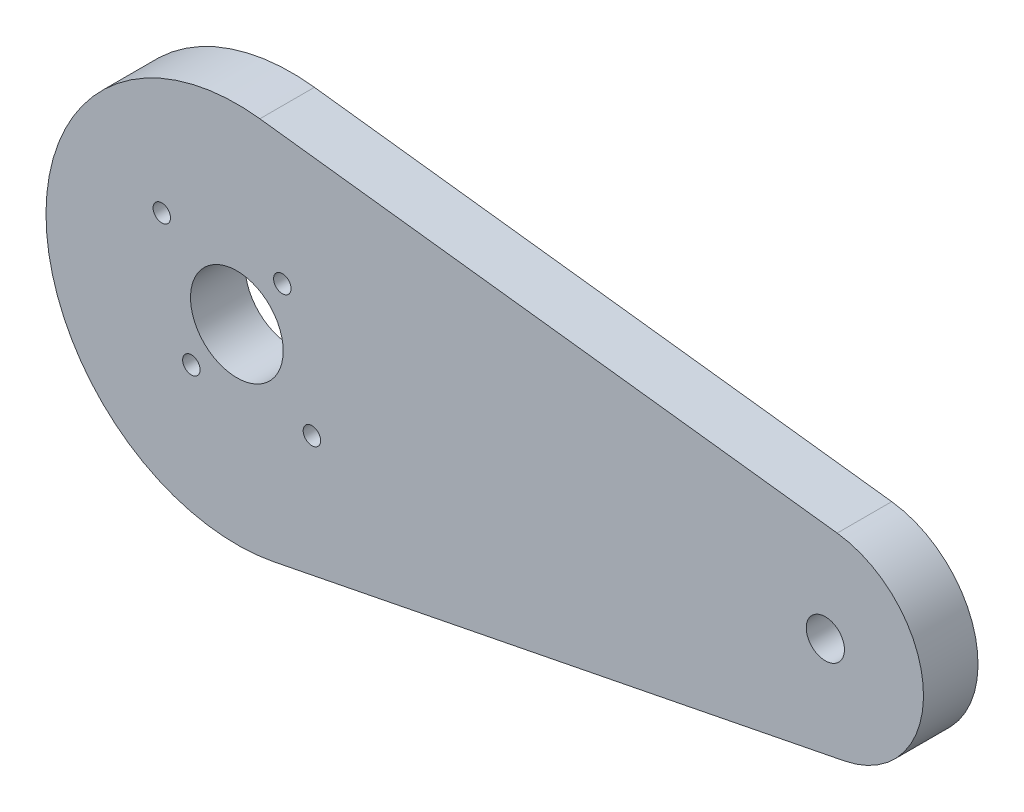
ISO-10303-21;
HEADER;
FILE_DESCRIPTION(('STEP AP214'),'2;1');
FILE_NAME('part.step','',(''),(''),'','','');
FILE_SCHEMA(('AUTOMOTIVE_DESIGN { 1 0 10303 214 1 1 1 1 }'));
ENDSEC;
DATA;
#1=APPLICATION_CONTEXT('core data for automotive mechanical design processes');
#2=APPLICATION_PROTOCOL_DEFINITION('international standard','automotive_design',2000,#1);
#3=PRODUCT_CONTEXT('',#1,'mechanical');
#4=PRODUCT('Part','Part','',(#3));
#5=PRODUCT_RELATED_PRODUCT_CATEGORY('part','',(#4));
#6=PRODUCT_DEFINITION_FORMATION('','',#4);
#7=PRODUCT_DEFINITION_CONTEXT('part definition',#1,'design');
#8=PRODUCT_DEFINITION('design','',#6,#7);
#9=PRODUCT_DEFINITION_SHAPE('','',#8);
#10=(LENGTH_UNIT() NAMED_UNIT(*) SI_UNIT(.MILLI.,.METRE.));
#11=(NAMED_UNIT(*) PLANE_ANGLE_UNIT() SI_UNIT($,.RADIAN.));
#12=(NAMED_UNIT(*) SI_UNIT($,.STERADIAN.) SOLID_ANGLE_UNIT());
#13=UNCERTAINTY_MEASURE_WITH_UNIT(LENGTH_MEASURE(1.E-05),#10,'distance_accuracy_value','');
#14=(GEOMETRIC_REPRESENTATION_CONTEXT(3) GLOBAL_UNCERTAINTY_ASSIGNED_CONTEXT((#13)) GLOBAL_UNIT_ASSIGNED_CONTEXT((#10,
#11,#12)) REPRESENTATION_CONTEXT('',''));
#15=CARTESIAN_POINT('',(0.,0.,0.));
#16=DIRECTION('',(0.,0.,1.));
#17=DIRECTION('',(1.,0.,0.));
#18=AXIS2_PLACEMENT_3D('',#15,#16,#17);
#19=CARTESIAN_POINT('',(33.742734460424,59.5858139379744,-5.));
#20=DIRECTION('',(0.,0.,1.));
#21=DIRECTION('',(1.,0.,0.));
#22=AXIS2_PLACEMENT_3D('',#19,#20,#21);
#23=CYLINDRICAL_SURFACE('',#22,9.);
#24=CARTESIAN_POINT('',(33.742734460424,59.5858139379744,0.));
#25=DIRECTION('',(0.,0.,1.));
#26=DIRECTION('',(-1.,0.,0.));
#27=AXIS2_PLACEMENT_3D('',#24,#25,#26);
#28=CIRCLE('',#27,9.);
#29=CARTESIAN_POINT('',(35.488558308543,50.7567653430612,0.));
#30=VERTEX_POINT('',#29);
#31=CARTESIAN_POINT('',(34.8282886549802,68.5201058567937,0.));
#32=VERTEX_POINT('',#31);
#33=EDGE_CURVE('E98',#30,#32,#28,.T.);
#34=ORIENTED_EDGE('',*,*,#33,.F.);
#35=DIRECTION('',(0.,0.,1.));
#36=VECTOR('',#35,1.);
#37=CARTESIAN_POINT('',(35.488558308543,50.7567653430612,-5.));
#38=LINE('',#37,#36);
#39=CARTESIAN_POINT('',(35.488558308543,50.7567653430612,-5.));
#40=VERTEX_POINT('',#39);
#41=EDGE_CURVE('E11',#40,#30,#38,.T.);
#42=ORIENTED_EDGE('',*,*,#41,.F.);
#43=CARTESIAN_POINT('',(33.742734460424,59.5858139379744,-5.));
#44=DIRECTION('',(0.,0.,1.));
#45=DIRECTION('',(-1.,0.,0.));
#46=AXIS2_PLACEMENT_3D('',#43,#44,#45);
#47=CIRCLE('',#46,9.);
#48=CARTESIAN_POINT('',(34.8282886549802,68.5201058567937,-5.));
#49=VERTEX_POINT('',#48);
#50=EDGE_CURVE('E91',#40,#49,#47,.T.);
#51=ORIENTED_EDGE('',*,*,#50,.T.);
#52=DIRECTION('',(0.,0.,1.));
#53=VECTOR('',#52,1.);
#54=CARTESIAN_POINT('',(34.8282886549802,68.5201058567937,-5.));
#55=LINE('',#54,#53);
#56=EDGE_CURVE('E36',#49,#32,#55,.T.);
#57=ORIENTED_EDGE('',*,*,#56,.T.);
#58=EDGE_LOOP('',(#34,#42,#51,#57));
#59=FACE_BOUND('',#58,.T.);
#60=ADVANCED_FACE('F33',(#59),#23,.T.);
#61=CARTESIAN_POINT('',(-16.825342517547,40.4124055098915,-5.));
#62=DIRECTION('',(0.193980427568784,-0.9810053994348,0.));
#63=DIRECTION('',(0.9810053994348,0.193980427568784,0.));
#64=AXIS2_PLACEMENT_3D('',#61,#62,#63);
#65=PLANE('',#64);
#66=DIRECTION('',(0.9810053994348,0.193980427568784,0.));
#67=VECTOR('',#66,1.);
#68=CARTESIAN_POINT('',(-16.825342517547,40.4124055098915,0.));
#69=LINE('',#68,#67);
#70=CARTESIAN_POINT('',(-16.825342517547,40.4124055098915,0.));
#71=VERTEX_POINT('',#70);
#72=EDGE_CURVE('E93',#71,#30,#69,.T.);
#73=ORIENTED_EDGE('',*,*,#72,.F.);
#74=DIRECTION('',(0.,0.,1.));
#75=VECTOR('',#74,1.);
#76=CARTESIAN_POINT('',(-16.825342517547,40.4124055098915,-5.));
#77=LINE('',#76,#75);
#78=CARTESIAN_POINT('',(-16.825342517547,40.4124055098915,-5.));
#79=VERTEX_POINT('',#78);
#80=EDGE_CURVE('E42',#79,#71,#77,.T.);
#81=ORIENTED_EDGE('',*,*,#80,.F.);
#82=DIRECTION('',(0.9810053994348,0.193980427568784,0.));
#83=VECTOR('',#82,1.);
#84=CARTESIAN_POINT('',(-16.825342517547,40.4124055098915,-5.));
#85=LINE('',#84,#83);
#86=EDGE_CURVE('E88',#79,#40,#85,.T.);
#87=ORIENTED_EDGE('',*,*,#86,.T.);
#88=ORIENTED_EDGE('',*,*,#41,.T.);
#89=EDGE_LOOP('',(#73,#81,#87,#88));
#90=FACE_BOUND('',#89,.T.);
#91=ADVANCED_FACE('F109',(#90),#65,.T.);
#92=CARTESIAN_POINT('',(-20.22,57.5799999999968,-5.));
#93=DIRECTION('',(0.,0.,1.));
#94=DIRECTION('',(1.,0.,0.));
#95=AXIS2_PLACEMENT_3D('',#92,#93,#94);
#96=CYLINDRICAL_SURFACE('',#95,17.4999999999963);
#97=CARTESIAN_POINT('',(-20.22,57.5799999999968,0.));
#98=DIRECTION('',(0.,0.,1.));
#99=DIRECTION('',(1.,0.,0.));
#100=AXIS2_PLACEMENT_3D('',#97,#98,#99);
#101=CIRCLE('',#100,17.4999999999963);
#102=CARTESIAN_POINT('',(-18.1092001772522,74.9522342865864,0.));
#103=VERTEX_POINT('',#102);
#104=EDGE_CURVE('E83',#103,#71,#101,.T.);
#105=ORIENTED_EDGE('',*,*,#104,.F.);
#106=DIRECTION('',(0.,0.,1.));
#107=VECTOR('',#106,1.);
#108=CARTESIAN_POINT('',(-18.1092001772522,74.9522342865864,-5.));
#109=LINE('',#108,#107);
#110=CARTESIAN_POINT('',(-18.1092001772522,74.9522342865864,-5.));
#111=VERTEX_POINT('',#110);
#112=EDGE_CURVE('E78',#111,#103,#109,.T.);
#113=ORIENTED_EDGE('',*,*,#112,.F.);
#114=CARTESIAN_POINT('',(-20.22,57.5799999999968,-5.));
#115=DIRECTION('',(0.,0.,1.));
#116=DIRECTION('',(1.,0.,0.));
#117=AXIS2_PLACEMENT_3D('',#114,#115,#116);
#118=CIRCLE('',#117,17.4999999999963);
#119=EDGE_CURVE('E81',#111,#79,#118,.T.);
#120=ORIENTED_EDGE('',*,*,#119,.T.);
#121=ORIENTED_EDGE('',*,*,#80,.T.);
#122=EDGE_LOOP('',(#105,#113,#120,#121));
#123=FACE_BOUND('',#122,.T.);
#124=ADVANCED_FACE('F80',(#123),#96,.T.);
#125=CARTESIAN_POINT('',(34.8282886549802,68.5201058567937,-5.));
#126=DIRECTION('',(0.120617132728473,0.992699102091042,0.));
#127=DIRECTION('',(-0.992699102091043,0.120617132728473,0.));
#128=AXIS2_PLACEMENT_3D('',#125,#126,#127);
#129=PLANE('',#128);
#130=DIRECTION('',(-0.992699102091043,0.120617132728473,0.));
#131=VECTOR('',#130,1.);
#132=CARTESIAN_POINT('',(34.8282886549802,68.5201058567937,0.));
#133=LINE('',#132,#131);
#134=EDGE_CURVE('E101',#32,#103,#133,.T.);
#135=ORIENTED_EDGE('',*,*,#134,.F.);
#136=ORIENTED_EDGE('',*,*,#56,.F.);
#137=DIRECTION('',(-0.992699102091043,0.120617132728473,0.));
#138=VECTOR('',#137,1.);
#139=CARTESIAN_POINT('',(34.8282886549802,68.5201058567937,-5.));
#140=LINE('',#139,#138);
#141=EDGE_CURVE('E87',#49,#111,#140,.T.);
#142=ORIENTED_EDGE('',*,*,#141,.T.);
#143=ORIENTED_EDGE('',*,*,#112,.T.);
#144=EDGE_LOOP('',(#135,#136,#142,#143));
#145=FACE_BOUND('',#144,.T.);
#146=ADVANCED_FACE('F90',(#145),#129,.T.);
#147=CARTESIAN_POINT('',(33.742734460424,59.5858139379744,-5.));
#148=DIRECTION('',(0.,0.,-1.));
#149=DIRECTION('',(-1.,0.,0.));
#150=AXIS2_PLACEMENT_3D('',#147,#148,#149);
#151=PLANE('',#150);
#152=CARTESIAN_POINT('',(-24.3892947318219,52.2715650668737,-5.));
#153=DIRECTION('',(0.,0.,1.));
#154=DIRECTION('',(1.,0.,0.));
#155=AXIS2_PLACEMENT_3D('',#152,#153,#154);
#156=CIRCLE('',#155,0.800000000000006);
#157=CARTESIAN_POINT('',(-23.5892947318219,52.2715650668737,-5.));
#158=VERTEX_POINT('',#157);
#159=EDGE_CURVE('E158',#158,#158,#156,.T.);
#160=ORIENTED_EDGE('',*,*,#159,.T.);
#161=EDGE_LOOP('',(#160));
#162=FACE_BOUND('',#161,.T.);
#163=CARTESIAN_POINT('',(-13.3386954570625,52.1753586809685,-5.));
#164=DIRECTION('',(0.,0.,1.));
#165=DIRECTION('',(1.,0.,0.));
#166=AXIS2_PLACEMENT_3D('',#163,#164,#165);
#167=CIRCLE('',#166,0.800000000000006);
#168=CARTESIAN_POINT('',(-12.5386954570625,52.1753586809685,-5.));
#169=VERTEX_POINT('',#168);
#170=EDGE_CURVE('E166',#169,#169,#167,.T.);
#171=ORIENTED_EDGE('',*,*,#170,.T.);
#172=EDGE_LOOP('',(#171));
#173=FACE_BOUND('',#172,.T.);
#174=CARTESIAN_POINT('',(-16.0507052681782,62.88843493312,-5.));
#175=DIRECTION('',(0.,0.,1.));
#176=DIRECTION('',(1.,0.,0.));
#177=AXIS2_PLACEMENT_3D('',#174,#175,#176);
#178=CIRCLE('',#177,0.799999999999994);
#179=CARTESIAN_POINT('',(-15.2507052681782,62.88843493312,-5.));
#180=VERTEX_POINT('',#179);
#181=EDGE_CURVE('E172',#180,#180,#178,.T.);
#182=ORIENTED_EDGE('',*,*,#181,.T.);
#183=EDGE_LOOP('',(#182));
#184=FACE_BOUND('',#183,.T.);
#185=CARTESIAN_POINT('',(-27.1013045429374,62.9846413190252,-5.));
#186=DIRECTION('',(0.,0.,1.));
#187=DIRECTION('',(1.,0.,0.));
#188=AXIS2_PLACEMENT_3D('',#185,#186,#187);
#189=CIRCLE('',#188,0.800000000000001);
#190=CARTESIAN_POINT('',(-26.3013045429374,62.9846413190252,-5.));
#191=VERTEX_POINT('',#190);
#192=EDGE_CURVE('E178',#191,#191,#189,.T.);
#193=ORIENTED_EDGE('',*,*,#192,.T.);
#194=EDGE_LOOP('',(#193));
#195=FACE_BOUND('',#194,.T.);
#196=CARTESIAN_POINT('',(-20.22,57.5799999999968,-5.));
#197=DIRECTION('',(0.,0.,1.));
#198=DIRECTION('',(1.,0.,0.));
#199=AXIS2_PLACEMENT_3D('',#196,#197,#198);
#200=CIRCLE('',#199,4.25);
#201=CARTESIAN_POINT('',(-15.97,57.5799999999968,-5.));
#202=VERTEX_POINT('',#201);
#203=EDGE_CURVE('E184',#202,#202,#200,.T.);
#204=ORIENTED_EDGE('',*,*,#203,.T.);
#205=EDGE_LOOP('',(#204));
#206=FACE_BOUND('',#205,.T.);
#207=CARTESIAN_POINT('',(33.742734460424,59.5858139379744,-5.));
#208=DIRECTION('',(0.,0.,1.));
#209=DIRECTION('',(1.,0.,0.));
#210=AXIS2_PLACEMENT_3D('',#207,#208,#209);
#211=CIRCLE('',#210,1.75000000000001);
#212=CARTESIAN_POINT('',(35.492734460424,59.5858139379744,-5.));
#213=VERTEX_POINT('',#212);
#214=EDGE_CURVE('E102',#213,#213,#211,.T.);
#215=ORIENTED_EDGE('',*,*,#214,.T.);
#216=EDGE_LOOP('',(#215));
#217=FACE_BOUND('',#216,.T.);
#218=ORIENTED_EDGE('',*,*,#50,.F.);
#219=ORIENTED_EDGE('',*,*,#86,.F.);
#220=ORIENTED_EDGE('',*,*,#119,.F.);
#221=ORIENTED_EDGE('',*,*,#141,.F.);
#222=EDGE_LOOP('',(#218,#219,#220,#221));
#223=FACE_BOUND('',#222,.T.);
#224=ADVANCED_FACE('F86',(#162,#173,#184,#195,#206,#217,#223),#151,.T.);
#225=CARTESIAN_POINT('',(33.742734460424,59.5858139379744,0.));
#226=DIRECTION('',(0.,0.,-1.));
#227=DIRECTION('',(-1.,0.,0.));
#228=AXIS2_PLACEMENT_3D('',#225,#226,#227);
#229=PLANE('',#228);
#230=CARTESIAN_POINT('',(-24.3892947318219,52.2715650668737,0.));
#231=DIRECTION('',(0.,0.,1.));
#232=DIRECTION('',(1.,0.,0.));
#233=AXIS2_PLACEMENT_3D('',#230,#231,#232);
#234=CIRCLE('',#233,0.800000000000006);
#235=CARTESIAN_POINT('',(-23.5892947318219,52.2715650668737,0.));
#236=VERTEX_POINT('',#235);
#237=EDGE_CURVE('E161',#236,#236,#234,.T.);
#238=ORIENTED_EDGE('',*,*,#237,.F.);
#239=EDGE_LOOP('',(#238));
#240=FACE_BOUND('',#239,.T.);
#241=CARTESIAN_POINT('',(-13.3386954570625,52.1753586809685,0.));
#242=DIRECTION('',(0.,0.,1.));
#243=DIRECTION('',(1.,0.,0.));
#244=AXIS2_PLACEMENT_3D('',#241,#242,#243);
#245=CIRCLE('',#244,0.800000000000006);
#246=CARTESIAN_POINT('',(-12.5386954570625,52.1753586809685,0.));
#247=VERTEX_POINT('',#246);
#248=EDGE_CURVE('E163',#247,#247,#245,.T.);
#249=ORIENTED_EDGE('',*,*,#248,.F.);
#250=EDGE_LOOP('',(#249));
#251=FACE_BOUND('',#250,.T.);
#252=CARTESIAN_POINT('',(-16.0507052681782,62.88843493312,0.));
#253=DIRECTION('',(0.,0.,1.));
#254=DIRECTION('',(1.,0.,0.));
#255=AXIS2_PLACEMENT_3D('',#252,#253,#254);
#256=CIRCLE('',#255,0.799999999999994);
#257=CARTESIAN_POINT('',(-15.2507052681782,62.88843493312,0.));
#258=VERTEX_POINT('',#257);
#259=EDGE_CURVE('E169',#258,#258,#256,.T.);
#260=ORIENTED_EDGE('',*,*,#259,.F.);
#261=EDGE_LOOP('',(#260));
#262=FACE_BOUND('',#261,.T.);
#263=CARTESIAN_POINT('',(-27.1013045429374,62.9846413190252,0.));
#264=DIRECTION('',(0.,0.,1.));
#265=DIRECTION('',(1.,0.,0.));
#266=AXIS2_PLACEMENT_3D('',#263,#264,#265);
#267=CIRCLE('',#266,0.800000000000001);
#268=CARTESIAN_POINT('',(-26.3013045429374,62.9846413190252,0.));
#269=VERTEX_POINT('',#268);
#270=EDGE_CURVE('E175',#269,#269,#267,.T.);
#271=ORIENTED_EDGE('',*,*,#270,.F.);
#272=EDGE_LOOP('',(#271));
#273=FACE_BOUND('',#272,.T.);
#274=CARTESIAN_POINT('',(-20.22,57.5799999999968,0.));
#275=DIRECTION('',(0.,0.,1.));
#276=DIRECTION('',(1.,0.,0.));
#277=AXIS2_PLACEMENT_3D('',#274,#275,#276);
#278=CIRCLE('',#277,4.25);
#279=CARTESIAN_POINT('',(-15.97,57.5799999999968,0.));
#280=VERTEX_POINT('',#279);
#281=EDGE_CURVE('E181',#280,#280,#278,.T.);
#282=ORIENTED_EDGE('',*,*,#281,.F.);
#283=EDGE_LOOP('',(#282));
#284=FACE_BOUND('',#283,.T.);
#285=CARTESIAN_POINT('',(33.742734460424,59.5858139379744,0.));
#286=DIRECTION('',(0.,0.,1.));
#287=DIRECTION('',(1.,0.,0.));
#288=AXIS2_PLACEMENT_3D('',#285,#286,#287);
#289=CIRCLE('',#288,1.75000000000001);
#290=CARTESIAN_POINT('',(35.492734460424,59.5858139379744,0.));
#291=VERTEX_POINT('',#290);
#292=EDGE_CURVE('E187',#291,#291,#289,.T.);
#293=ORIENTED_EDGE('',*,*,#292,.F.);
#294=EDGE_LOOP('',(#293));
#295=FACE_BOUND('',#294,.T.);
#296=ORIENTED_EDGE('',*,*,#33,.T.);
#297=ORIENTED_EDGE('',*,*,#134,.T.);
#298=ORIENTED_EDGE('',*,*,#104,.T.);
#299=ORIENTED_EDGE('',*,*,#72,.T.);
#300=EDGE_LOOP('',(#296,#297,#298,#299));
#301=FACE_BOUND('',#300,.T.);
#302=ADVANCED_FACE('F108',(#240,#251,#262,#273,#284,#295,#301),#229,.F.);
#303=CARTESIAN_POINT('',(33.742734460424,59.5858139379744,-5.));
#304=DIRECTION('',(0.,0.,1.));
#305=DIRECTION('',(1.,0.,0.));
#306=AXIS2_PLACEMENT_3D('',#303,#304,#305);
#307=CYLINDRICAL_SURFACE('',#306,1.75000000000001);
#308=ORIENTED_EDGE('',*,*,#214,.F.);
#309=EDGE_LOOP('',(#308));
#310=FACE_BOUND('',#309,.T.);
#311=ORIENTED_EDGE('',*,*,#292,.T.);
#312=EDGE_LOOP('',(#311));
#313=FACE_BOUND('',#312,.T.);
#314=ADVANCED_FACE('F127',(#310,#313),#307,.F.);
#315=CARTESIAN_POINT('',(-20.22,57.5799999999968,-5.));
#316=DIRECTION('',(0.,0.,1.));
#317=DIRECTION('',(1.,0.,0.));
#318=AXIS2_PLACEMENT_3D('',#315,#316,#317);
#319=CYLINDRICAL_SURFACE('',#318,4.25);
#320=ORIENTED_EDGE('',*,*,#203,.F.);
#321=EDGE_LOOP('',(#320));
#322=FACE_BOUND('',#321,.T.);
#323=ORIENTED_EDGE('',*,*,#281,.T.);
#324=EDGE_LOOP('',(#323));
#325=FACE_BOUND('',#324,.T.);
#326=ADVANCED_FACE('F134',(#322,#325),#319,.F.);
#327=CARTESIAN_POINT('',(-27.1013045429374,62.9846413190252,-5.));
#328=DIRECTION('',(0.,0.,1.));
#329=DIRECTION('',(1.,0.,0.));
#330=AXIS2_PLACEMENT_3D('',#327,#328,#329);
#331=CYLINDRICAL_SURFACE('',#330,0.800000000000001);
#332=ORIENTED_EDGE('',*,*,#192,.F.);
#333=EDGE_LOOP('',(#332));
#334=FACE_BOUND('',#333,.T.);
#335=ORIENTED_EDGE('',*,*,#270,.T.);
#336=EDGE_LOOP('',(#335));
#337=FACE_BOUND('',#336,.T.);
#338=ADVANCED_FACE('F138',(#334,#337),#331,.F.);
#339=CARTESIAN_POINT('',(-16.0507052681782,62.88843493312,-5.));
#340=DIRECTION('',(0.,0.,1.));
#341=DIRECTION('',(1.,0.,0.));
#342=AXIS2_PLACEMENT_3D('',#339,#340,#341);
#343=CYLINDRICAL_SURFACE('',#342,0.799999999999994);
#344=ORIENTED_EDGE('',*,*,#181,.F.);
#345=EDGE_LOOP('',(#344));
#346=FACE_BOUND('',#345,.T.);
#347=ORIENTED_EDGE('',*,*,#259,.T.);
#348=EDGE_LOOP('',(#347));
#349=FACE_BOUND('',#348,.T.);
#350=ADVANCED_FACE('F142',(#346,#349),#343,.F.);
#351=CARTESIAN_POINT('',(-13.3386954570625,52.1753586809685,-5.));
#352=DIRECTION('',(0.,0.,1.));
#353=DIRECTION('',(1.,0.,0.));
#354=AXIS2_PLACEMENT_3D('',#351,#352,#353);
#355=CYLINDRICAL_SURFACE('',#354,0.800000000000006);
#356=ORIENTED_EDGE('',*,*,#170,.F.);
#357=EDGE_LOOP('',(#356));
#358=FACE_BOUND('',#357,.T.);
#359=ORIENTED_EDGE('',*,*,#248,.T.);
#360=EDGE_LOOP('',(#359));
#361=FACE_BOUND('',#360,.T.);
#362=ADVANCED_FACE('F146',(#358,#361),#355,.F.);
#363=CARTESIAN_POINT('',(-24.3892947318219,52.2715650668737,-5.));
#364=DIRECTION('',(0.,0.,1.));
#365=DIRECTION('',(1.,0.,0.));
#366=AXIS2_PLACEMENT_3D('',#363,#364,#365);
#367=CYLINDRICAL_SURFACE('',#366,0.800000000000006);
#368=ORIENTED_EDGE('',*,*,#159,.F.);
#369=EDGE_LOOP('',(#368));
#370=FACE_BOUND('',#369,.T.);
#371=ORIENTED_EDGE('',*,*,#237,.T.);
#372=EDGE_LOOP('',(#371));
#373=FACE_BOUND('',#372,.T.);
#374=ADVANCED_FACE('F150',(#370,#373),#367,.F.);
#375=CLOSED_SHELL('',(#60,#91,#124,#146,#224,#302,#314,#326,#338,#350,#362,#374));
#376=MANIFOLD_SOLID_BREP('B2',#375);
#377=ADVANCED_BREP_SHAPE_REPRESENTATION('',(#18,#376),#14);
#378=SHAPE_DEFINITION_REPRESENTATION(#9,#377);
ENDSEC;
END-ISO-10303-21;
